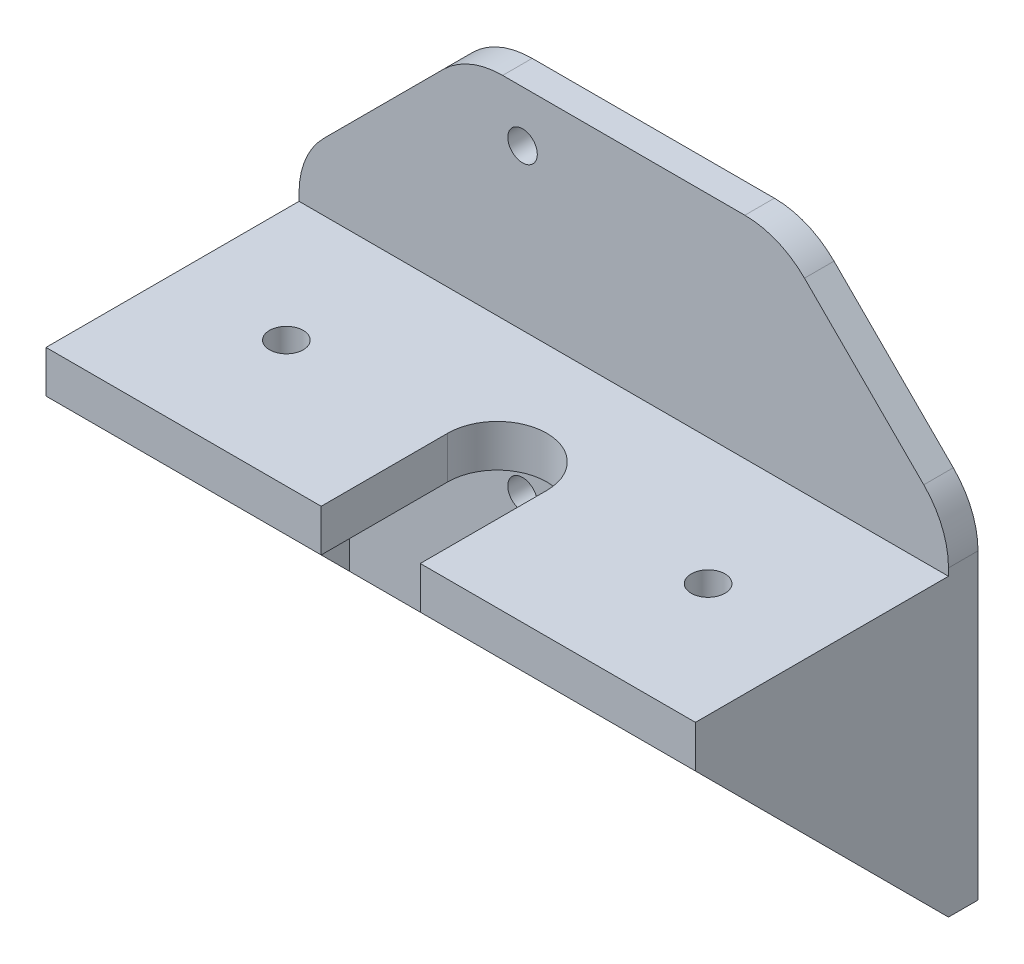
ISO-10303-21;
HEADER;
FILE_DESCRIPTION(('STEP AP214'),'2;1');
FILE_NAME('part.step','',(''),(''),'','','');
FILE_SCHEMA(('AUTOMOTIVE_DESIGN { 1 0 10303 214 1 1 1 1 }'));
ENDSEC;
DATA;
#1=APPLICATION_CONTEXT('core data for automotive mechanical design processes');
#2=APPLICATION_PROTOCOL_DEFINITION('international standard','automotive_design',2000,#1);
#3=PRODUCT_CONTEXT('',#1,'mechanical');
#4=PRODUCT('Part','Part','',(#3));
#5=PRODUCT_RELATED_PRODUCT_CATEGORY('part','',(#4));
#6=PRODUCT_DEFINITION_FORMATION('','',#4);
#7=PRODUCT_DEFINITION_CONTEXT('part definition',#1,'design');
#8=PRODUCT_DEFINITION('design','',#6,#7);
#9=PRODUCT_DEFINITION_SHAPE('','',#8);
#10=(LENGTH_UNIT() NAMED_UNIT(*) SI_UNIT(.MILLI.,.METRE.));
#11=(NAMED_UNIT(*) PLANE_ANGLE_UNIT() SI_UNIT($,.RADIAN.));
#12=(NAMED_UNIT(*) SI_UNIT($,.STERADIAN.) SOLID_ANGLE_UNIT());
#13=UNCERTAINTY_MEASURE_WITH_UNIT(LENGTH_MEASURE(1.E-05),#10,'distance_accuracy_value','');
#14=(GEOMETRIC_REPRESENTATION_CONTEXT(3) GLOBAL_UNCERTAINTY_ASSIGNED_CONTEXT((#13)) GLOBAL_UNIT_ASSIGNED_CONTEXT((#10,
#11,#12)) REPRESENTATION_CONTEXT('',''));
#15=CARTESIAN_POINT('',(0.,0.,0.));
#16=DIRECTION('',(0.,0.,1.));
#17=DIRECTION('',(1.,0.,0.));
#18=AXIS2_PLACEMENT_3D('',#15,#16,#17);
#19=CARTESIAN_POINT('',(0.,0.,3.5));
#20=DIRECTION('',(0.,0.,1.));
#21=DIRECTION('',(1.,0.,0.));
#22=AXIS2_PLACEMENT_3D('',#19,#20,#21);
#23=PLANE('',#22);
#24=CARTESIAN_POINT('',(-24.,0.,3.5));
#25=DIRECTION('',(0.,0.,1.));
#26=DIRECTION('',(1.,0.,0.));
#27=AXIS2_PLACEMENT_3D('',#24,#25,#26);
#28=CIRCLE('',#27,1.75);
#29=CARTESIAN_POINT('',(-22.25,0.,3.5));
#30=VERTEX_POINT('',#29);
#31=EDGE_CURVE('E238',#30,#30,#28,.T.);
#32=ORIENTED_EDGE('',*,*,#31,.F.);
#33=EDGE_LOOP('',(#32));
#34=FACE_BOUND('',#33,.T.);
#35=CARTESIAN_POINT('',(0.,0.,3.5));
#36=DIRECTION('',(0.,0.,1.));
#37=DIRECTION('',(1.,0.,0.));
#38=AXIS2_PLACEMENT_3D('',#35,#36,#37);
#39=CIRCLE('',#38,1.75);
#40=CARTESIAN_POINT('',(1.75,0.,3.5));
#41=VERTEX_POINT('',#40);
#42=EDGE_CURVE('E230',#41,#41,#39,.T.);
#43=ORIENTED_EDGE('',*,*,#42,.F.);
#44=EDGE_LOOP('',(#43));
#45=FACE_BOUND('',#44,.T.);
#46=DIRECTION('',(1.,0.,0.));
#47=VECTOR('',#46,1.);
#48=CARTESIAN_POINT('',(-50.5,11.85,3.5));
#49=LINE('',#48,#47);
#50=CARTESIAN_POINT('',(-44.5,11.85,3.5));
#51=VERTEX_POINT('',#50);
#52=CARTESIAN_POINT('',(20.5,11.85,3.5));
#53=VERTEX_POINT('',#52);
#54=EDGE_CURVE('E195',#51,#53,#49,.T.);
#55=ORIENTED_EDGE('',*,*,#54,.F.);
#56=DIRECTION('',(0.,-1.,0.));
#57=VECTOR('',#56,1.);
#58=CARTESIAN_POINT('',(-44.5,0.,3.5));
#59=LINE('',#58,#57);
#60=CARTESIAN_POINT('',(-44.5,-18.15,3.50000000000002));
#61=VERTEX_POINT('',#60);
#62=EDGE_CURVE('E186',#51,#61,#59,.T.);
#63=ORIENTED_EDGE('',*,*,#62,.T.);
#64=DIRECTION('',(1.,0.,0.));
#65=VECTOR('',#64,1.);
#66=CARTESIAN_POINT('',(-50.5,-18.15,3.5));
#67=LINE('',#66,#65);
#68=CARTESIAN_POINT('',(20.5,-18.15,3.5));
#69=VERTEX_POINT('',#68);
#70=EDGE_CURVE('E181',#61,#69,#67,.T.);
#71=ORIENTED_EDGE('',*,*,#70,.T.);
#72=DIRECTION('',(0.,1.,0.));
#73=VECTOR('',#72,1.);
#74=CARTESIAN_POINT('',(20.5,0.,3.5));
#75=LINE('',#74,#73);
#76=EDGE_CURVE('E398',#69,#53,#75,.T.);
#77=ORIENTED_EDGE('',*,*,#76,.T.);
#78=EDGE_LOOP('',(#55,#63,#71,#77));
#79=FACE_BOUND('',#78,.T.);
#80=ADVANCED_FACE('F34',(#34,#45,#79),#23,.T.);
#81=CARTESIAN_POINT('',(-50.5,11.85,33.5));
#82=DIRECTION('',(0.,1.,0.));
#83=DIRECTION('',(0.,0.,1.));
#84=AXIS2_PLACEMENT_3D('',#81,#82,#83);
#85=PLANE('',#84);
#86=CARTESIAN_POINT('',(-37.,11.85,18.5));
#87=DIRECTION('',(0.,1.,0.));
#88=DIRECTION('',(0.,0.,1.));
#89=AXIS2_PLACEMENT_3D('',#86,#87,#88);
#90=CIRCLE('',#89,2.);
#91=CARTESIAN_POINT('',(-37.,11.85,20.5));
#92=VERTEX_POINT('',#91);
#93=EDGE_CURVE('E391',#92,#92,#90,.T.);
#94=ORIENTED_EDGE('',*,*,#93,.T.);
#95=EDGE_LOOP('',(#94));
#96=FACE_BOUND('',#95,.T.);
#97=CARTESIAN_POINT('',(13.,11.85,18.5));
#98=DIRECTION('',(0.,1.,0.));
#99=DIRECTION('',(0.,0.,1.));
#100=AXIS2_PLACEMENT_3D('',#97,#98,#99);
#101=CIRCLE('',#100,2.);
#102=CARTESIAN_POINT('',(13.,11.85,20.5));
#103=VERTEX_POINT('',#102);
#104=EDGE_CURVE('E385',#103,#103,#101,.T.);
#105=ORIENTED_EDGE('',*,*,#104,.T.);
#106=EDGE_LOOP('',(#105));
#107=FACE_BOUND('',#106,.T.);
#108=DIRECTION('',(0.,0.,1.));
#109=VECTOR('',#108,1.);
#110=CARTESIAN_POINT('',(-44.5,11.85,33.5));
#111=LINE('',#110,#109);
#112=CARTESIAN_POINT('',(-44.5,11.85,33.5));
#113=VERTEX_POINT('',#112);
#114=EDGE_CURVE('E188',#51,#113,#111,.T.);
#115=ORIENTED_EDGE('',*,*,#114,.F.);
#116=ORIENTED_EDGE('',*,*,#54,.T.);
#117=DIRECTION('',(0.,0.,-1.));
#118=VECTOR('',#117,1.);
#119=CARTESIAN_POINT('',(20.5,11.85,33.5));
#120=LINE('',#119,#118);
#121=CARTESIAN_POINT('',(20.5,11.85,33.5));
#122=VERTEX_POINT('',#121);
#123=EDGE_CURVE('E400',#122,#53,#120,.T.);
#124=ORIENTED_EDGE('',*,*,#123,.F.);
#125=DIRECTION('',(1.,0.,0.));
#126=VECTOR('',#125,1.);
#127=CARTESIAN_POINT('',(-50.5,11.85,33.5));
#128=LINE('',#127,#126);
#129=CARTESIAN_POINT('',(-6.12500000000001,11.85,33.5));
#130=VERTEX_POINT('',#129);
#131=EDGE_CURVE('E361',#130,#122,#128,.T.);
#132=ORIENTED_EDGE('',*,*,#131,.F.);
#133=DIRECTION('',(0.,0.,-1.));
#134=VECTOR('',#133,1.);
#135=CARTESIAN_POINT('',(-6.12500000000001,11.85,33.5));
#136=LINE('',#135,#134);
#137=CARTESIAN_POINT('',(-6.125,11.85,18.5));
#138=VERTEX_POINT('',#137);
#139=EDGE_CURVE('E367',#130,#138,#136,.T.);
#140=ORIENTED_EDGE('',*,*,#139,.T.);
#141=CARTESIAN_POINT('',(-12.,11.85,18.5));
#142=DIRECTION('',(0.,1.,0.));
#143=DIRECTION('',(0.,0.,1.));
#144=AXIS2_PLACEMENT_3D('',#141,#142,#143);
#145=CIRCLE('',#144,5.875);
#146=CARTESIAN_POINT('',(-17.875,11.85,18.5));
#147=VERTEX_POINT('',#146);
#148=EDGE_CURVE('E364',#138,#147,#145,.T.);
#149=ORIENTED_EDGE('',*,*,#148,.T.);
#150=DIRECTION('',(0.,0.,1.));
#151=VECTOR('',#150,1.);
#152=CARTESIAN_POINT('',(-17.875,11.85,33.5));
#153=LINE('',#152,#151);
#154=CARTESIAN_POINT('',(-17.875,11.85,33.5));
#155=VERTEX_POINT('',#154);
#156=EDGE_CURVE('E370',#147,#155,#153,.T.);
#157=ORIENTED_EDGE('',*,*,#156,.T.);
#158=EDGE_CURVE('E360',#113,#155,#128,.T.);
#159=ORIENTED_EDGE('',*,*,#158,.F.);
#160=EDGE_LOOP('',(#115,#116,#124,#132,#140,#149,#157,#159));
#161=FACE_BOUND('',#160,.T.);
#162=ADVANCED_FACE('F272',(#96,#107,#161),#85,.F.);
#163=CARTESIAN_POINT('',(0.,0.,33.5));
#164=DIRECTION('',(0.,0.,1.));
#165=DIRECTION('',(1.,0.,0.));
#166=AXIS2_PLACEMENT_3D('',#163,#164,#165);
#167=PLANE('',#166);
#168=DIRECTION('',(-1.,0.,0.));
#169=VECTOR('',#168,1.);
#170=CARTESIAN_POINT('',(-50.5,16.85,33.5));
#171=LINE('',#170,#169);
#172=CARTESIAN_POINT('',(26.5,16.85,33.5));
#173=VERTEX_POINT('',#172);
#174=CARTESIAN_POINT('',(-6.12500000000001,16.85,33.5));
#175=VERTEX_POINT('',#174);
#176=EDGE_CURVE('E349',#173,#175,#171,.T.);
#177=ORIENTED_EDGE('',*,*,#176,.T.);
#178=DIRECTION('',(0.,1.,0.));
#179=VECTOR('',#178,1.);
#180=CARTESIAN_POINT('',(-6.12500000000001,0.,33.5));
#181=LINE('',#180,#179);
#182=EDGE_CURVE('E421',#130,#175,#181,.T.);
#183=ORIENTED_EDGE('',*,*,#182,.F.);
#184=ORIENTED_EDGE('',*,*,#131,.T.);
#185=CARTESIAN_POINT('',(26.5,11.85,33.5));
#186=VERTEX_POINT('',#185);
#187=EDGE_CURVE('E363',#122,#186,#128,.T.);
#188=ORIENTED_EDGE('',*,*,#187,.T.);
#189=DIRECTION('',(0.,1.,0.));
#190=VECTOR('',#189,1.);
#191=CARTESIAN_POINT('',(26.5,16.85,33.5));
#192=LINE('',#191,#190);
#193=EDGE_CURVE('E354',#186,#173,#192,.T.);
#194=ORIENTED_EDGE('',*,*,#193,.T.);
#195=EDGE_LOOP('',(#177,#183,#184,#188,#194));
#196=FACE_BOUND('',#195,.T.);
#197=ADVANCED_FACE('F278',(#196),#167,.T.);
#198=DIRECTION('',(0.707106781186549,0.707106781186546,0.));
#199=VECTOR('',#198,1.);
#200=CARTESIAN_POINT('',(-36.1749999999999,36.175,3.5));
#201=LINE('',#200,#199);
#202=CARTESIAN_POINT('',(-33.4289321881344,38.9210678118655,3.5));
#203=VERTEX_POINT('',#202);
#204=CARTESIAN_POINT('',(-47.5710678118655,24.7789321881345,3.5));
#205=VERTEX_POINT('',#204);
#206=EDGE_CURVE('E298',#203,#205,#201,.F.);
#207=ORIENTED_EDGE('',*,*,#206,.T.);
#208=CARTESIAN_POINT('',(-40.5,17.707864376269,3.5));
#209=DIRECTION('',(0.,0.,1.));
#210=DIRECTION('',(1.,0.,0.));
#211=AXIS2_PLACEMENT_3D('',#208,#209,#210);
#212=CIRCLE('',#211,10.);
#213=CARTESIAN_POINT('',(-50.5,17.707864376269,3.5));
#214=VERTEX_POINT('',#213);
#215=EDGE_CURVE('E301',#205,#214,#212,.T.);
#216=ORIENTED_EDGE('',*,*,#215,.T.);
#217=DIRECTION('',(0.,-1.,0.));
#218=VECTOR('',#217,1.);
#219=CARTESIAN_POINT('',(-50.5,41.85,3.5));
#220=LINE('',#219,#218);
#221=CARTESIAN_POINT('',(-50.5,16.85,3.5));
#222=VERTEX_POINT('',#221);
#223=EDGE_CURVE('E202',#214,#222,#220,.T.);
#224=ORIENTED_EDGE('',*,*,#223,.T.);
#225=DIRECTION('',(-1.,0.,0.));
#226=VECTOR('',#225,1.);
#227=CARTESIAN_POINT('',(-50.5,16.85,3.5));
#228=LINE('',#227,#226);
#229=CARTESIAN_POINT('',(26.5,16.85,3.5));
#230=VERTEX_POINT('',#229);
#231=EDGE_CURVE('E218',#230,#222,#228,.T.);
#232=ORIENTED_EDGE('',*,*,#231,.F.);
#233=DIRECTION('',(0.,1.,0.));
#234=VECTOR('',#233,1.);
#235=CARTESIAN_POINT('',(26.5,41.85,3.5));
#236=LINE('',#235,#234);
#237=CARTESIAN_POINT('',(26.5,17.707864376269,3.5));
#238=VERTEX_POINT('',#237);
#239=EDGE_CURVE('E180',#230,#238,#236,.T.);
#240=ORIENTED_EDGE('',*,*,#239,.T.);
#241=CARTESIAN_POINT('',(16.5,17.707864376269,3.5));
#242=DIRECTION('',(0.,0.,1.));
#243=DIRECTION('',(1.,0.,0.));
#244=AXIS2_PLACEMENT_3D('',#241,#242,#243);
#245=CIRCLE('',#244,10.);
#246=CARTESIAN_POINT('',(23.5710678118655,24.7789321881344,3.5));
#247=VERTEX_POINT('',#246);
#248=EDGE_CURVE('E55',#238,#247,#245,.T.);
#249=ORIENTED_EDGE('',*,*,#248,.T.);
#250=DIRECTION('',(0.707106781186546,-0.707106781186549,0.));
#251=VECTOR('',#250,1.);
#252=CARTESIAN_POINT('',(24.175,24.1749999999999,3.5));
#253=LINE('',#252,#251);
#254=CARTESIAN_POINT('',(9.42893218813451,38.9210678118655,3.5));
#255=VERTEX_POINT('',#254);
#256=EDGE_CURVE('E308',#247,#255,#253,.F.);
#257=ORIENTED_EDGE('',*,*,#256,.T.);
#258=CARTESIAN_POINT('',(2.35786437626903,31.85,3.5));
#259=DIRECTION('',(0.,0.,1.));
#260=DIRECTION('',(1.,0.,0.));
#261=AXIS2_PLACEMENT_3D('',#258,#259,#260);
#262=CIRCLE('',#261,10.);
#263=CARTESIAN_POINT('',(2.35786437626903,41.85,3.5));
#264=VERTEX_POINT('',#263);
#265=EDGE_CURVE('E461',#255,#264,#262,.T.);
#266=ORIENTED_EDGE('',*,*,#265,.T.);
#267=DIRECTION('',(-1.,0.,0.));
#268=VECTOR('',#267,1.);
#269=CARTESIAN_POINT('',(-50.5,41.85,3.5));
#270=LINE('',#269,#268);
#271=CARTESIAN_POINT('',(-26.357864376269,41.85,3.5));
#272=VERTEX_POINT('',#271);
#273=EDGE_CURVE('E211',#264,#272,#270,.T.);
#274=ORIENTED_EDGE('',*,*,#273,.T.);
#275=CARTESIAN_POINT('',(-26.357864376269,31.85,3.5));
#276=DIRECTION('',(0.,0.,1.));
#277=DIRECTION('',(1.,0.,0.));
#278=AXIS2_PLACEMENT_3D('',#275,#276,#277);
#279=CIRCLE('',#278,10.);
#280=EDGE_CURVE('E304',#272,#203,#279,.T.);
#281=ORIENTED_EDGE('',*,*,#280,.T.);
#282=EDGE_LOOP('',(#207,#216,#224,#232,#240,#249,#257,#266,#274,#281));
#283=FACE_BOUND('',#282,.T.);
#284=CARTESIAN_POINT('',(-24.,35.8,3.5));
#285=DIRECTION('',(0.,0.,1.));
#286=DIRECTION('',(1.,0.,0.));
#287=AXIS2_PLACEMENT_3D('',#284,#285,#286);
#288=CIRCLE('',#287,1.75);
#289=CARTESIAN_POINT('',(-22.25,35.8,3.5));
#290=VERTEX_POINT('',#289);
#291=EDGE_CURVE('E244',#290,#290,#288,.T.);
#292=ORIENTED_EDGE('',*,*,#291,.F.);
#293=EDGE_LOOP('',(#292));
#294=FACE_BOUND('',#293,.T.);
#295=ADVANCED_FACE('F274',(#283,#294),#23,.T.);
#296=CARTESIAN_POINT('',(0.,0.,0.));
#297=DIRECTION('',(0.,0.,1.));
#298=DIRECTION('',(1.,0.,0.));
#299=AXIS2_PLACEMENT_3D('',#296,#297,#298);
#300=PLANE('',#299);
#301=DIRECTION('',(0.,-1.,0.));
#302=VECTOR('',#301,1.);
#303=CARTESIAN_POINT('',(-50.5,41.85,0.));
#304=LINE('',#303,#302);
#305=CARTESIAN_POINT('',(-50.5,17.707864376269,0.));
#306=VERTEX_POINT('',#305);
#307=CARTESIAN_POINT('',(-50.5,-18.15,0.));
#308=VERTEX_POINT('',#307);
#309=EDGE_CURVE('E246',#306,#308,#304,.T.);
#310=ORIENTED_EDGE('',*,*,#309,.F.);
#311=CARTESIAN_POINT('',(-40.5,17.707864376269,0.));
#312=DIRECTION('',(0.,0.,1.));
#313=DIRECTION('',(1.,0.,0.));
#314=AXIS2_PLACEMENT_3D('',#311,#312,#313);
#315=CIRCLE('',#314,10.);
#316=CARTESIAN_POINT('',(-47.5710678118655,24.7789321881345,0.));
#317=VERTEX_POINT('',#316);
#318=EDGE_CURVE('E456',#306,#317,#315,.F.);
#319=ORIENTED_EDGE('',*,*,#318,.T.);
#320=DIRECTION('',(-0.707106781186549,-0.707106781186546,0.));
#321=VECTOR('',#320,1.);
#322=CARTESIAN_POINT('',(-50.5,21.85,0.));
#323=LINE('',#322,#321);
#324=CARTESIAN_POINT('',(-33.4289321881344,38.9210678118655,0.));
#325=VERTEX_POINT('',#324);
#326=EDGE_CURVE('E441',#317,#325,#323,.F.);
#327=ORIENTED_EDGE('',*,*,#326,.T.);
#328=CARTESIAN_POINT('',(-26.357864376269,31.85,0.));
#329=DIRECTION('',(0.,0.,1.));
#330=DIRECTION('',(1.,0.,0.));
#331=AXIS2_PLACEMENT_3D('',#328,#329,#330);
#332=CIRCLE('',#331,10.);
#333=CARTESIAN_POINT('',(-26.357864376269,41.85,0.));
#334=VERTEX_POINT('',#333);
#335=EDGE_CURVE('E454',#325,#334,#332,.F.);
#336=ORIENTED_EDGE('',*,*,#335,.T.);
#337=DIRECTION('',(-1.,0.,0.));
#338=VECTOR('',#337,1.);
#339=CARTESIAN_POINT('',(-50.5,41.85,0.));
#340=LINE('',#339,#338);
#341=CARTESIAN_POINT('',(2.35786437626903,41.85,0.));
#342=VERTEX_POINT('',#341);
#343=EDGE_CURVE('E203',#342,#334,#340,.T.);
#344=ORIENTED_EDGE('',*,*,#343,.F.);
#345=CARTESIAN_POINT('',(2.35786437626903,31.85,0.));
#346=DIRECTION('',(0.,0.,1.));
#347=DIRECTION('',(1.,0.,0.));
#348=AXIS2_PLACEMENT_3D('',#345,#346,#347);
#349=CIRCLE('',#348,10.);
#350=CARTESIAN_POINT('',(9.42893218813451,38.9210678118655,0.));
#351=VERTEX_POINT('',#350);
#352=EDGE_CURVE('E450',#342,#351,#349,.F.);
#353=ORIENTED_EDGE('',*,*,#352,.T.);
#354=DIRECTION('',(-0.707106781186546,0.707106781186549,0.));
#355=VECTOR('',#354,1.);
#356=CARTESIAN_POINT('',(6.49999999999998,41.85,0.));
#357=LINE('',#356,#355);
#358=CARTESIAN_POINT('',(23.5710678118655,24.7789321881344,0.));
#359=VERTEX_POINT('',#358);
#360=EDGE_CURVE('E438',#351,#359,#357,.F.);
#361=ORIENTED_EDGE('',*,*,#360,.T.);
#362=CARTESIAN_POINT('',(16.5,17.707864376269,0.));
#363=DIRECTION('',(0.,0.,1.));
#364=DIRECTION('',(1.,0.,0.));
#365=AXIS2_PLACEMENT_3D('',#362,#363,#364);
#366=CIRCLE('',#365,10.);
#367=CARTESIAN_POINT('',(26.5,17.707864376269,0.));
#368=VERTEX_POINT('',#367);
#369=EDGE_CURVE('E452',#359,#368,#366,.F.);
#370=ORIENTED_EDGE('',*,*,#369,.T.);
#371=DIRECTION('',(0.,1.,0.));
#372=VECTOR('',#371,1.);
#373=CARTESIAN_POINT('',(26.5,41.85,0.));
#374=LINE('',#373,#372);
#375=CARTESIAN_POINT('',(26.5,-18.15,0.));
#376=VERTEX_POINT('',#375);
#377=EDGE_CURVE('E336',#376,#368,#374,.T.);
#378=ORIENTED_EDGE('',*,*,#377,.F.);
#379=DIRECTION('',(1.,0.,0.));
#380=VECTOR('',#379,1.);
#381=CARTESIAN_POINT('',(-50.5,-18.15,0.));
#382=LINE('',#381,#380);
#383=EDGE_CURVE('E475',#308,#376,#382,.T.);
#384=ORIENTED_EDGE('',*,*,#383,.F.);
#385=EDGE_LOOP('',(#310,#319,#327,#336,#344,#353,#361,#370,#378,#384));
#386=FACE_BOUND('',#385,.T.);
#387=CARTESIAN_POINT('',(-24.,0.,0.));
#388=DIRECTION('',(0.,0.,1.));
#389=DIRECTION('',(1.,0.,0.));
#390=AXIS2_PLACEMENT_3D('',#387,#388,#389);
#391=CIRCLE('',#390,1.75);
#392=CARTESIAN_POINT('',(-22.25,0.,0.));
#393=VERTEX_POINT('',#392);
#394=EDGE_CURVE('E233',#393,#393,#391,.T.);
#395=ORIENTED_EDGE('',*,*,#394,.T.);
#396=EDGE_LOOP('',(#395));
#397=FACE_BOUND('',#396,.T.);
#398=CARTESIAN_POINT('',(-24.,35.8,0.));
#399=DIRECTION('',(0.,0.,1.));
#400=DIRECTION('',(1.,0.,0.));
#401=AXIS2_PLACEMENT_3D('',#398,#399,#400);
#402=CIRCLE('',#401,1.75);
#403=CARTESIAN_POINT('',(-22.25,35.8,0.));
#404=VERTEX_POINT('',#403);
#405=EDGE_CURVE('E241',#404,#404,#402,.T.);
#406=ORIENTED_EDGE('',*,*,#405,.T.);
#407=EDGE_LOOP('',(#406));
#408=FACE_BOUND('',#407,.T.);
#409=CARTESIAN_POINT('',(0.,0.,0.));
#410=DIRECTION('',(0.,0.,1.));
#411=DIRECTION('',(1.,0.,0.));
#412=AXIS2_PLACEMENT_3D('',#409,#410,#411);
#413=CIRCLE('',#412,1.75);
#414=CARTESIAN_POINT('',(1.75,0.,0.));
#415=VERTEX_POINT('',#414);
#416=EDGE_CURVE('E234',#415,#415,#413,.T.);
#417=ORIENTED_EDGE('',*,*,#416,.T.);
#418=EDGE_LOOP('',(#417));
#419=FACE_BOUND('',#418,.T.);
#420=ADVANCED_FACE('F250',(#386,#397,#408,#419),#300,.F.);
#421=CARTESIAN_POINT('',(-50.5,41.85,3.5));
#422=DIRECTION('',(1.,0.,0.));
#423=DIRECTION('',(0.,0.,-1.));
#424=AXIS2_PLACEMENT_3D('',#421,#422,#423);
#425=PLANE('',#424);
#426=ORIENTED_EDGE('',*,*,#223,.F.);
#427=DIRECTION('',(0.,0.,1.));
#428=VECTOR('',#427,1.);
#429=CARTESIAN_POINT('',(-50.5,17.707864376269,0.));
#430=LINE('',#429,#428);
#431=EDGE_CURVE('E307',#214,#306,#430,.F.);
#432=ORIENTED_EDGE('',*,*,#431,.T.);
#433=ORIENTED_EDGE('',*,*,#309,.T.);
#434=DIRECTION('',(0.,0.,-1.));
#435=VECTOR('',#434,1.);
#436=CARTESIAN_POINT('',(-50.5,-18.15,3.5));
#437=LINE('',#436,#435);
#438=CARTESIAN_POINT('',(-50.5,-18.15,3.50000000000002));
#439=VERTEX_POINT('',#438);
#440=EDGE_CURVE('E216',#439,#308,#437,.T.);
#441=ORIENTED_EDGE('',*,*,#440,.F.);
#442=DIRECTION('',(0.,-0.707106781186547,-0.707106781186547));
#443=VECTOR('',#442,1.);
#444=CARTESIAN_POINT('',(-50.5,11.85,33.5));
#445=LINE('',#444,#443);
#446=CARTESIAN_POINT('',(-50.5,11.85,33.5));
#447=VERTEX_POINT('',#446);
#448=EDGE_CURVE('E175',#447,#439,#445,.T.);
#449=ORIENTED_EDGE('',*,*,#448,.F.);
#450=DIRECTION('',(0.,-1.,0.));
#451=VECTOR('',#450,1.);
#452=CARTESIAN_POINT('',(-50.5,16.85,33.5));
#453=LINE('',#452,#451);
#454=CARTESIAN_POINT('',(-50.5,16.85,33.5));
#455=VERTEX_POINT('',#454);
#456=EDGE_CURVE('E222',#455,#447,#453,.T.);
#457=ORIENTED_EDGE('',*,*,#456,.F.);
#458=DIRECTION('',(0.,0.,-1.));
#459=VECTOR('',#458,1.);
#460=CARTESIAN_POINT('',(-50.5,16.85,33.5));
#461=LINE('',#460,#459);
#462=EDGE_CURVE('E223',#455,#222,#461,.T.);
#463=ORIENTED_EDGE('',*,*,#462,.T.);
#464=EDGE_LOOP('',(#426,#432,#433,#441,#449,#457,#463));
#465=FACE_BOUND('',#464,.T.);
#466=ADVANCED_FACE('F289',(#465),#425,.F.);
#467=CARTESIAN_POINT('',(-50.5,-18.15,3.5));
#468=DIRECTION('',(0.,1.,0.));
#469=DIRECTION('',(0.,0.,1.));
#470=AXIS2_PLACEMENT_3D('',#467,#468,#469);
#471=PLANE('',#470);
#472=ORIENTED_EDGE('',*,*,#383,.T.);
#473=DIRECTION('',(0.,0.,-1.));
#474=VECTOR('',#473,1.);
#475=CARTESIAN_POINT('',(26.5,-18.15,3.5));
#476=LINE('',#475,#474);
#477=CARTESIAN_POINT('',(26.5,-18.15,3.5));
#478=VERTEX_POINT('',#477);
#479=EDGE_CURVE('E411',#478,#376,#476,.T.);
#480=ORIENTED_EDGE('',*,*,#479,.F.);
#481=DIRECTION('',(1.,0.,0.));
#482=VECTOR('',#481,1.);
#483=CARTESIAN_POINT('',(-50.5,-18.15,3.50000000000001));
#484=LINE('',#483,#482);
#485=EDGE_CURVE('E200',#69,#478,#484,.T.);
#486=ORIENTED_EDGE('',*,*,#485,.F.);
#487=ORIENTED_EDGE('',*,*,#70,.F.);
#488=EDGE_CURVE('E169',#439,#61,#67,.T.);
#489=ORIENTED_EDGE('',*,*,#488,.F.);
#490=ORIENTED_EDGE('',*,*,#440,.T.);
#491=EDGE_LOOP('',(#472,#480,#486,#487,#489,#490));
#492=FACE_BOUND('',#491,.T.);
#493=ADVANCED_FACE('F198',(#492),#471,.F.);
#494=CARTESIAN_POINT('',(26.5,41.85,3.5));
#495=DIRECTION('',(-1.,0.,0.));
#496=DIRECTION('',(0.,-1.,0.));
#497=AXIS2_PLACEMENT_3D('',#494,#495,#496);
#498=PLANE('',#497);
#499=ORIENTED_EDGE('',*,*,#377,.T.);
#500=DIRECTION('',(0.,0.,-1.));
#501=VECTOR('',#500,1.);
#502=CARTESIAN_POINT('',(26.5,17.707864376269,3.5));
#503=LINE('',#502,#501);
#504=EDGE_CURVE('E326',#368,#238,#503,.F.);
#505=ORIENTED_EDGE('',*,*,#504,.T.);
#506=ORIENTED_EDGE('',*,*,#239,.F.);
#507=DIRECTION('',(0.,0.,-1.));
#508=VECTOR('',#507,1.);
#509=CARTESIAN_POINT('',(26.5,16.85,33.5));
#510=LINE('',#509,#508);
#511=EDGE_CURVE('E237',#173,#230,#510,.T.);
#512=ORIENTED_EDGE('',*,*,#511,.F.);
#513=ORIENTED_EDGE('',*,*,#193,.F.);
#514=DIRECTION('',(0.,-0.707106781186547,-0.707106781186547));
#515=VECTOR('',#514,1.);
#516=CARTESIAN_POINT('',(26.5,11.85,33.5));
#517=LINE('',#516,#515);
#518=EDGE_CURVE('E403',#186,#478,#517,.T.);
#519=ORIENTED_EDGE('',*,*,#518,.T.);
#520=ORIENTED_EDGE('',*,*,#479,.T.);
#521=EDGE_LOOP('',(#499,#505,#506,#512,#513,#519,#520));
#522=FACE_BOUND('',#521,.T.);
#523=ADVANCED_FACE('F267',(#522),#498,.F.);
#524=CARTESIAN_POINT('',(-50.5,41.85,3.5));
#525=DIRECTION('',(0.,-1.,0.));
#526=DIRECTION('',(0.,0.,-1.));
#527=AXIS2_PLACEMENT_3D('',#524,#525,#526);
#528=PLANE('',#527);
#529=ORIENTED_EDGE('',*,*,#343,.T.);
#530=DIRECTION('',(0.,0.,-1.));
#531=VECTOR('',#530,1.);
#532=CARTESIAN_POINT('',(-26.357864376269,41.85,3.5));
#533=LINE('',#532,#531);
#534=EDGE_CURVE('E319',#334,#272,#533,.F.);
#535=ORIENTED_EDGE('',*,*,#534,.T.);
#536=ORIENTED_EDGE('',*,*,#273,.F.);
#537=DIRECTION('',(0.,0.,1.));
#538=VECTOR('',#537,1.);
#539=CARTESIAN_POINT('',(2.35786437626903,41.85,0.));
#540=LINE('',#539,#538);
#541=EDGE_CURVE('E316',#264,#342,#540,.F.);
#542=ORIENTED_EDGE('',*,*,#541,.T.);
#543=EDGE_LOOP('',(#529,#535,#536,#542));
#544=FACE_BOUND('',#543,.T.);
#545=ADVANCED_FACE('F256',(#544),#528,.F.);
#546=CARTESIAN_POINT('',(-24.,35.8,3.5));
#547=DIRECTION('',(0.,0.,-1.));
#548=DIRECTION('',(-1.,0.,0.));
#549=AXIS2_PLACEMENT_3D('',#546,#547,#548);
#550=CYLINDRICAL_SURFACE('',#549,1.75);
#551=ORIENTED_EDGE('',*,*,#291,.T.);
#552=EDGE_LOOP('',(#551));
#553=FACE_BOUND('',#552,.T.);
#554=ORIENTED_EDGE('',*,*,#405,.F.);
#555=EDGE_LOOP('',(#554));
#556=FACE_BOUND('',#555,.T.);
#557=ADVANCED_FACE('F253',(#553,#556),#550,.F.);
#558=CARTESIAN_POINT('',(-24.,0.,3.5));
#559=DIRECTION('',(0.,0.,-1.));
#560=DIRECTION('',(-1.,0.,0.));
#561=AXIS2_PLACEMENT_3D('',#558,#559,#560);
#562=CYLINDRICAL_SURFACE('',#561,1.75);
#563=ORIENTED_EDGE('',*,*,#31,.T.);
#564=EDGE_LOOP('',(#563));
#565=FACE_BOUND('',#564,.T.);
#566=ORIENTED_EDGE('',*,*,#394,.F.);
#567=EDGE_LOOP('',(#566));
#568=FACE_BOUND('',#567,.T.);
#569=ADVANCED_FACE('F255',(#565,#568),#562,.F.);
#570=CARTESIAN_POINT('',(0.,0.,3.5));
#571=DIRECTION('',(0.,0.,-1.));
#572=DIRECTION('',(-1.,0.,0.));
#573=AXIS2_PLACEMENT_3D('',#570,#571,#572);
#574=CYLINDRICAL_SURFACE('',#573,1.75);
#575=ORIENTED_EDGE('',*,*,#42,.T.);
#576=EDGE_LOOP('',(#575));
#577=FACE_BOUND('',#576,.T.);
#578=ORIENTED_EDGE('',*,*,#416,.F.);
#579=EDGE_LOOP('',(#578));
#580=FACE_BOUND('',#579,.T.);
#581=ADVANCED_FACE('F263',(#577,#580),#574,.F.);
#582=CARTESIAN_POINT('',(-50.5,16.85,33.5));
#583=DIRECTION('',(0.,-1.,0.));
#584=DIRECTION('',(0.,0.,-1.));
#585=AXIS2_PLACEMENT_3D('',#582,#583,#584);
#586=PLANE('',#585);
#587=ORIENTED_EDGE('',*,*,#462,.F.);
#588=CARTESIAN_POINT('',(-17.875,16.85,33.5));
#589=VERTEX_POINT('',#588);
#590=EDGE_CURVE('E351',#589,#455,#171,.T.);
#591=ORIENTED_EDGE('',*,*,#590,.F.);
#592=DIRECTION('',(0.,0.,1.));
#593=VECTOR('',#592,1.);
#594=CARTESIAN_POINT('',(-17.875,16.85,18.5));
#595=LINE('',#594,#593);
#596=CARTESIAN_POINT('',(-17.875,16.85,18.5));
#597=VERTEX_POINT('',#596);
#598=EDGE_CURVE('E380',#597,#589,#595,.T.);
#599=ORIENTED_EDGE('',*,*,#598,.F.);
#600=CARTESIAN_POINT('',(-12.,16.85,18.5));
#601=DIRECTION('',(0.,1.,0.));
#602=DIRECTION('',(0.,0.,1.));
#603=AXIS2_PLACEMENT_3D('',#600,#601,#602);
#604=CIRCLE('',#603,5.875);
#605=CARTESIAN_POINT('',(-6.125,16.85,18.5));
#606=VERTEX_POINT('',#605);
#607=EDGE_CURVE('E382',#606,#597,#604,.T.);
#608=ORIENTED_EDGE('',*,*,#607,.F.);
#609=DIRECTION('',(0.,0.,-1.));
#610=VECTOR('',#609,1.);
#611=CARTESIAN_POINT('',(-6.125,16.85,18.5));
#612=LINE('',#611,#610);
#613=EDGE_CURVE('E376',#175,#606,#612,.T.);
#614=ORIENTED_EDGE('',*,*,#613,.F.);
#615=ORIENTED_EDGE('',*,*,#176,.F.);
#616=ORIENTED_EDGE('',*,*,#511,.T.);
#617=ORIENTED_EDGE('',*,*,#231,.T.);
#618=EDGE_LOOP('',(#587,#591,#599,#608,#614,#615,#616,#617));
#619=FACE_BOUND('',#618,.T.);
#620=CARTESIAN_POINT('',(-37.,16.85,18.5));
#621=DIRECTION('',(0.,1.,0.));
#622=DIRECTION('',(0.,0.,1.));
#623=AXIS2_PLACEMENT_3D('',#620,#621,#622);
#624=CIRCLE('',#623,2.);
#625=CARTESIAN_POINT('',(-37.,16.85,20.5));
#626=VERTEX_POINT('',#625);
#627=EDGE_CURVE('E394',#626,#626,#624,.T.);
#628=ORIENTED_EDGE('',*,*,#627,.F.);
#629=EDGE_LOOP('',(#628));
#630=FACE_BOUND('',#629,.T.);
#631=CARTESIAN_POINT('',(13.,16.85,18.5));
#632=DIRECTION('',(0.,1.,0.));
#633=DIRECTION('',(0.,0.,1.));
#634=AXIS2_PLACEMENT_3D('',#631,#632,#633);
#635=CIRCLE('',#634,2.);
#636=CARTESIAN_POINT('',(13.,16.85,20.5));
#637=VERTEX_POINT('',#636);
#638=EDGE_CURVE('E388',#637,#637,#635,.T.);
#639=ORIENTED_EDGE('',*,*,#638,.F.);
#640=EDGE_LOOP('',(#639));
#641=FACE_BOUND('',#640,.T.);
#642=ADVANCED_FACE('F342',(#619,#630,#641),#586,.F.);
#643=EDGE_CURVE('E357',#447,#113,#128,.T.);
#644=ORIENTED_EDGE('',*,*,#643,.T.);
#645=ORIENTED_EDGE('',*,*,#158,.T.);
#646=DIRECTION('',(0.,-1.,0.));
#647=VECTOR('',#646,1.);
#648=CARTESIAN_POINT('',(-17.875,0.,33.5));
#649=LINE('',#648,#647);
#650=EDGE_CURVE('E425',#589,#155,#649,.T.);
#651=ORIENTED_EDGE('',*,*,#650,.F.);
#652=ORIENTED_EDGE('',*,*,#590,.T.);
#653=ORIENTED_EDGE('',*,*,#456,.T.);
#654=EDGE_LOOP('',(#644,#645,#651,#652,#653));
#655=FACE_BOUND('',#654,.T.);
#656=ADVANCED_FACE('F294',(#655),#167,.T.);
#657=CARTESIAN_POINT('',(-12.,-3.15,18.5));
#658=DIRECTION('',(0.,1.,0.));
#659=DIRECTION('',(0.,0.,1.));
#660=AXIS2_PLACEMENT_3D('',#657,#658,#659);
#661=CYLINDRICAL_SURFACE('',#660,5.875);
#662=DIRECTION('',(0.,1.,0.));
#663=VECTOR('',#662,1.);
#664=CARTESIAN_POINT('',(-6.125,-3.15,18.5));
#665=LINE('',#664,#663);
#666=EDGE_CURVE('E373',#138,#606,#665,.T.);
#667=ORIENTED_EDGE('',*,*,#666,.T.);
#668=ORIENTED_EDGE('',*,*,#607,.T.);
#669=DIRECTION('',(0.,1.,0.));
#670=VECTOR('',#669,1.);
#671=CARTESIAN_POINT('',(-17.875,-3.15,18.5));
#672=LINE('',#671,#670);
#673=EDGE_CURVE('E374',#147,#597,#672,.T.);
#674=ORIENTED_EDGE('',*,*,#673,.F.);
#675=ORIENTED_EDGE('',*,*,#148,.F.);
#676=EDGE_LOOP('',(#667,#668,#674,#675));
#677=FACE_BOUND('',#676,.T.);
#678=ADVANCED_FACE('F433',(#677),#661,.F.);
#679=CARTESIAN_POINT('',(-6.125,-3.15,18.5));
#680=DIRECTION('',(1.,0.,0.));
#681=DIRECTION('',(0.,0.,-1.));
#682=AXIS2_PLACEMENT_3D('',#679,#680,#681);
#683=PLANE('',#682);
#684=ORIENTED_EDGE('',*,*,#182,.T.);
#685=ORIENTED_EDGE('',*,*,#613,.T.);
#686=ORIENTED_EDGE('',*,*,#666,.F.);
#687=ORIENTED_EDGE('',*,*,#139,.F.);
#688=EDGE_LOOP('',(#684,#685,#686,#687));
#689=FACE_BOUND('',#688,.T.);
#690=ADVANCED_FACE('F435',(#689),#683,.F.);
#691=CARTESIAN_POINT('',(-17.875,-3.15,18.5));
#692=DIRECTION('',(-1.,0.,0.));
#693=DIRECTION('',(0.,0.,1.));
#694=AXIS2_PLACEMENT_3D('',#691,#692,#693);
#695=PLANE('',#694);
#696=ORIENTED_EDGE('',*,*,#673,.T.);
#697=ORIENTED_EDGE('',*,*,#598,.T.);
#698=ORIENTED_EDGE('',*,*,#650,.T.);
#699=ORIENTED_EDGE('',*,*,#156,.F.);
#700=EDGE_LOOP('',(#696,#697,#698,#699));
#701=FACE_BOUND('',#700,.T.);
#702=ADVANCED_FACE('F427',(#701),#695,.F.);
#703=CARTESIAN_POINT('',(13.,-3.15,18.5));
#704=DIRECTION('',(0.,1.,0.));
#705=DIRECTION('',(0.,0.,1.));
#706=AXIS2_PLACEMENT_3D('',#703,#704,#705);
#707=CYLINDRICAL_SURFACE('',#706,2.);
#708=ORIENTED_EDGE('',*,*,#638,.T.);
#709=EDGE_LOOP('',(#708));
#710=FACE_BOUND('',#709,.T.);
#711=ORIENTED_EDGE('',*,*,#104,.F.);
#712=EDGE_LOOP('',(#711));
#713=FACE_BOUND('',#712,.T.);
#714=ADVANCED_FACE('F575',(#710,#713),#707,.F.);
#715=CARTESIAN_POINT('',(-37.,-3.15,18.5));
#716=DIRECTION('',(0.,1.,0.));
#717=DIRECTION('',(0.,0.,1.));
#718=AXIS2_PLACEMENT_3D('',#715,#716,#717);
#719=CYLINDRICAL_SURFACE('',#718,2.);
#720=ORIENTED_EDGE('',*,*,#627,.T.);
#721=EDGE_LOOP('',(#720));
#722=FACE_BOUND('',#721,.T.);
#723=ORIENTED_EDGE('',*,*,#93,.F.);
#724=EDGE_LOOP('',(#723));
#725=FACE_BOUND('',#724,.T.);
#726=ADVANCED_FACE('F567',(#722,#725),#719,.F.);
#727=CARTESIAN_POINT('',(26.5,11.85,33.5));
#728=DIRECTION('',(0.,-0.707106781186548,0.707106781186548));
#729=DIRECTION('',(0.,-0.707106781186547,-0.707106781186547));
#730=AXIS2_PLACEMENT_3D('',#727,#728,#729);
#731=PLANE('',#730);
#732=DIRECTION('',(0.,-0.707106781186547,-0.707106781186547));
#733=VECTOR('',#732,1.);
#734=CARTESIAN_POINT('',(20.5,11.85,33.5));
#735=LINE('',#734,#733);
#736=EDGE_CURVE('E196',#122,#69,#735,.T.);
#737=ORIENTED_EDGE('',*,*,#736,.T.);
#738=ORIENTED_EDGE('',*,*,#485,.T.);
#739=ORIENTED_EDGE('',*,*,#518,.F.);
#740=ORIENTED_EDGE('',*,*,#187,.F.);
#741=EDGE_LOOP('',(#737,#738,#739,#740));
#742=FACE_BOUND('',#741,.T.);
#743=ADVANCED_FACE('F414',(#742),#731,.T.);
#744=CARTESIAN_POINT('',(20.5,11.85,16.7500125));
#745=DIRECTION('',(1.,0.,0.));
#746=DIRECTION('',(0.,1.,0.));
#747=AXIS2_PLACEMENT_3D('',#744,#745,#746);
#748=PLANE('',#747);
#749=ORIENTED_EDGE('',*,*,#76,.F.);
#750=ORIENTED_EDGE('',*,*,#736,.F.);
#751=ORIENTED_EDGE('',*,*,#123,.T.);
#752=EDGE_LOOP('',(#749,#750,#751));
#753=FACE_BOUND('',#752,.T.);
#754=ADVANCED_FACE('F417',(#753),#748,.F.);
#755=CARTESIAN_POINT('',(-50.5,11.85,33.5));
#756=DIRECTION('',(0.,0.707106781186548,-0.707106781186548));
#757=DIRECTION('',(0.,-0.707106781186547,-0.707106781186547));
#758=AXIS2_PLACEMENT_3D('',#755,#756,#757);
#759=PLANE('',#758);
#760=ORIENTED_EDGE('',*,*,#448,.T.);
#761=ORIENTED_EDGE('',*,*,#488,.T.);
#762=DIRECTION('',(0.,-0.707106781186547,-0.707106781186547));
#763=VECTOR('',#762,1.);
#764=CARTESIAN_POINT('',(-44.5,11.85,33.5));
#765=LINE('',#764,#763);
#766=EDGE_CURVE('E172',#113,#61,#765,.T.);
#767=ORIENTED_EDGE('',*,*,#766,.F.);
#768=ORIENTED_EDGE('',*,*,#643,.F.);
#769=EDGE_LOOP('',(#760,#761,#767,#768));
#770=FACE_BOUND('',#769,.T.);
#771=ADVANCED_FACE('F171',(#770),#759,.F.);
#772=CARTESIAN_POINT('',(-44.5,11.85,16.7500125));
#773=DIRECTION('',(-1.,0.,0.));
#774=DIRECTION('',(0.,-1.,0.));
#775=AXIS2_PLACEMENT_3D('',#772,#773,#774);
#776=PLANE('',#775);
#777=ORIENTED_EDGE('',*,*,#62,.F.);
#778=ORIENTED_EDGE('',*,*,#114,.T.);
#779=ORIENTED_EDGE('',*,*,#766,.T.);
#780=EDGE_LOOP('',(#777,#778,#779));
#781=FACE_BOUND('',#780,.T.);
#782=ADVANCED_FACE('F185',(#781),#776,.F.);
#783=CARTESIAN_POINT('',(-50.5,21.85,3.5));
#784=DIRECTION('',(0.707106781186546,-0.707106781186549,0.));
#785=DIRECTION('',(0.,0.,-1.));
#786=AXIS2_PLACEMENT_3D('',#783,#784,#785);
#787=PLANE('',#786);
#788=ORIENTED_EDGE('',*,*,#326,.F.);
#789=DIRECTION('',(0.,0.,-1.));
#790=VECTOR('',#789,1.);
#791=CARTESIAN_POINT('',(-47.5710678118655,24.7789321881345,3.5));
#792=LINE('',#791,#790);
#793=EDGE_CURVE('E314',#317,#205,#792,.F.);
#794=ORIENTED_EDGE('',*,*,#793,.T.);
#795=ORIENTED_EDGE('',*,*,#206,.F.);
#796=DIRECTION('',(0.,0.,1.));
#797=VECTOR('',#796,1.);
#798=CARTESIAN_POINT('',(-33.4289321881344,38.9210678118655,0.));
#799=LINE('',#798,#797);
#800=EDGE_CURVE('E458',#203,#325,#799,.F.);
#801=ORIENTED_EDGE('',*,*,#800,.T.);
#802=EDGE_LOOP('',(#788,#794,#795,#801));
#803=FACE_BOUND('',#802,.T.);
#804=ADVANCED_FACE('F481',(#803),#787,.F.);
#805=CARTESIAN_POINT('',(6.49999999999998,41.85,3.5));
#806=DIRECTION('',(-0.707106781186549,-0.707106781186546,0.));
#807=DIRECTION('',(0.,0.,-1.));
#808=AXIS2_PLACEMENT_3D('',#805,#806,#807);
#809=PLANE('',#808);
#810=ORIENTED_EDGE('',*,*,#256,.F.);
#811=DIRECTION('',(0.,0.,1.));
#812=VECTOR('',#811,1.);
#813=CARTESIAN_POINT('',(23.5710678118655,24.7789321881344,0.));
#814=LINE('',#813,#812);
#815=EDGE_CURVE('E11',#247,#359,#814,.F.);
#816=ORIENTED_EDGE('',*,*,#815,.T.);
#817=ORIENTED_EDGE('',*,*,#360,.F.);
#818=DIRECTION('',(0.,0.,-1.));
#819=VECTOR('',#818,1.);
#820=CARTESIAN_POINT('',(9.42893218813451,38.9210678118655,3.5));
#821=LINE('',#820,#819);
#822=EDGE_CURVE('E42',#351,#255,#821,.F.);
#823=ORIENTED_EDGE('',*,*,#822,.T.);
#824=EDGE_LOOP('',(#810,#816,#817,#823));
#825=FACE_BOUND('',#824,.T.);
#826=ADVANCED_FACE('F471',(#825),#809,.F.);
#827=CARTESIAN_POINT('',(-40.5,17.707864376269,3.5));
#828=DIRECTION('',(0.,0.,-1.));
#829=DIRECTION('',(-1.,0.,0.));
#830=AXIS2_PLACEMENT_3D('',#827,#828,#829);
#831=CYLINDRICAL_SURFACE('',#830,10.);
#832=ORIENTED_EDGE('',*,*,#215,.F.);
#833=ORIENTED_EDGE('',*,*,#793,.F.);
#834=ORIENTED_EDGE('',*,*,#318,.F.);
#835=ORIENTED_EDGE('',*,*,#431,.F.);
#836=EDGE_LOOP('',(#832,#833,#834,#835));
#837=FACE_BOUND('',#836,.T.);
#838=ADVANCED_FACE('F313',(#837),#831,.T.);
#839=CARTESIAN_POINT('',(-26.357864376269,31.85,3.5));
#840=DIRECTION('',(0.,0.,1.));
#841=DIRECTION('',(1.,0.,0.));
#842=AXIS2_PLACEMENT_3D('',#839,#840,#841);
#843=CYLINDRICAL_SURFACE('',#842,10.);
#844=ORIENTED_EDGE('',*,*,#335,.F.);
#845=ORIENTED_EDGE('',*,*,#800,.F.);
#846=ORIENTED_EDGE('',*,*,#280,.F.);
#847=ORIENTED_EDGE('',*,*,#534,.F.);
#848=EDGE_LOOP('',(#844,#845,#846,#847));
#849=FACE_BOUND('',#848,.T.);
#850=ADVANCED_FACE('F483',(#849),#843,.T.);
#851=CARTESIAN_POINT('',(16.5,17.707864376269,3.5));
#852=DIRECTION('',(0.,0.,1.));
#853=DIRECTION('',(1.,0.,0.));
#854=AXIS2_PLACEMENT_3D('',#851,#852,#853);
#855=CYLINDRICAL_SURFACE('',#854,10.);
#856=ORIENTED_EDGE('',*,*,#369,.F.);
#857=ORIENTED_EDGE('',*,*,#815,.F.);
#858=ORIENTED_EDGE('',*,*,#248,.F.);
#859=ORIENTED_EDGE('',*,*,#504,.F.);
#860=EDGE_LOOP('',(#856,#857,#858,#859));
#861=FACE_BOUND('',#860,.T.);
#862=ADVANCED_FACE('F473',(#861),#855,.T.);
#863=CARTESIAN_POINT('',(2.35786437626903,31.85,3.5));
#864=DIRECTION('',(0.,0.,-1.));
#865=DIRECTION('',(-1.,0.,0.));
#866=AXIS2_PLACEMENT_3D('',#863,#864,#865);
#867=CYLINDRICAL_SURFACE('',#866,10.);
#868=ORIENTED_EDGE('',*,*,#265,.F.);
#869=ORIENTED_EDGE('',*,*,#822,.F.);
#870=ORIENTED_EDGE('',*,*,#352,.F.);
#871=ORIENTED_EDGE('',*,*,#541,.F.);
#872=EDGE_LOOP('',(#868,#869,#870,#871));
#873=FACE_BOUND('',#872,.T.);
#874=ADVANCED_FACE('F36',(#873),#867,.T.);
#875=CLOSED_SHELL('',(#80,#162,#197,#295,#420,#466,#493,#523,#545,#557,#569,#581,#642,#656,#678,
#690,#702,#714,#726,#743,#754,#771,#782,#804,#826,#838,#850,#862,#874));
#876=MANIFOLD_SOLID_BREP('B2',#875);
#877=ADVANCED_BREP_SHAPE_REPRESENTATION('',(#18,#876),#14);
#878=SHAPE_DEFINITION_REPRESENTATION(#9,#877);
ENDSEC;
END-ISO-10303-21;
